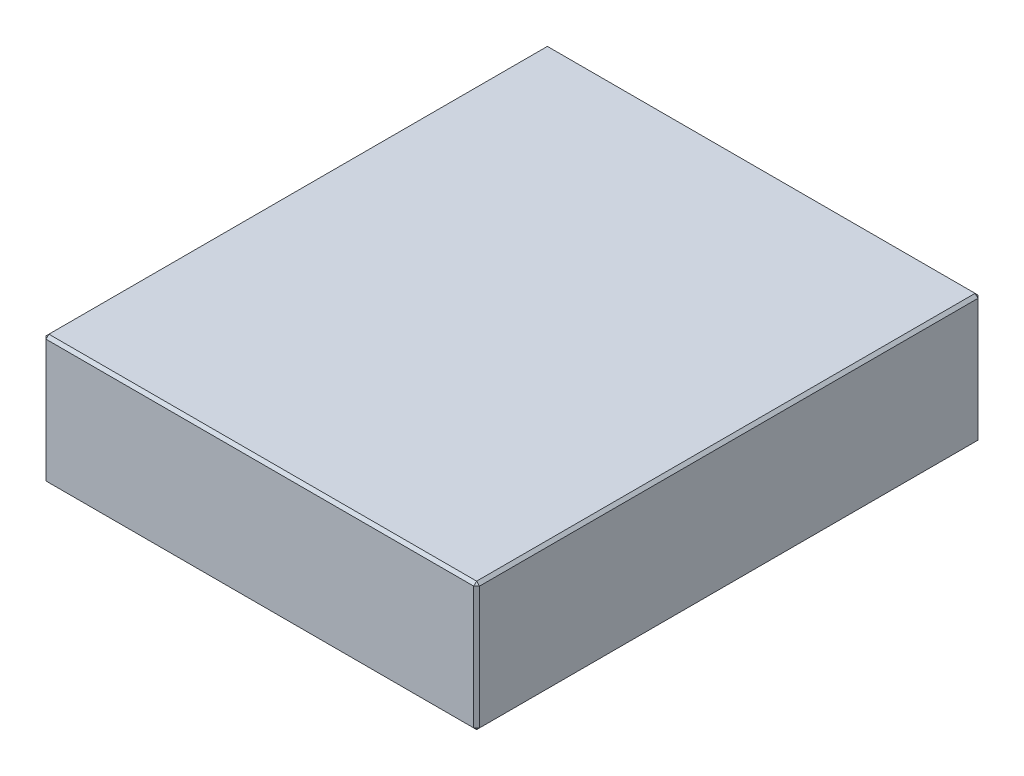
ISO-10303-21;
HEADER;
FILE_DESCRIPTION(('STEP AP214'),'2;1');
FILE_NAME('part.step','',(''),(''),'','','');
FILE_SCHEMA(('AUTOMOTIVE_DESIGN { 1 0 10303 214 1 1 1 1 }'));
ENDSEC;
DATA;
#1=APPLICATION_CONTEXT('core data for automotive mechanical design processes');
#2=APPLICATION_PROTOCOL_DEFINITION('international standard','automotive_design',2000,#1);
#3=PRODUCT_CONTEXT('',#1,'mechanical');
#4=PRODUCT('Part','Part','',(#3));
#5=PRODUCT_RELATED_PRODUCT_CATEGORY('part','',(#4));
#6=PRODUCT_DEFINITION_FORMATION('','',#4);
#7=PRODUCT_DEFINITION_CONTEXT('part definition',#1,'design');
#8=PRODUCT_DEFINITION('design','',#6,#7);
#9=PRODUCT_DEFINITION_SHAPE('','',#8);
#10=(LENGTH_UNIT() NAMED_UNIT(*) SI_UNIT(.MILLI.,.METRE.));
#11=(NAMED_UNIT(*) PLANE_ANGLE_UNIT() SI_UNIT($,.RADIAN.));
#12=(NAMED_UNIT(*) SI_UNIT($,.STERADIAN.) SOLID_ANGLE_UNIT());
#13=UNCERTAINTY_MEASURE_WITH_UNIT(LENGTH_MEASURE(1.E-05),#10,'distance_accuracy_value','');
#14=(GEOMETRIC_REPRESENTATION_CONTEXT(3) GLOBAL_UNCERTAINTY_ASSIGNED_CONTEXT((#13)) GLOBAL_UNIT_ASSIGNED_CONTEXT((#10,
#11,#12)) REPRESENTATION_CONTEXT('',''));
#15=CARTESIAN_POINT('',(0.,0.,0.));
#16=DIRECTION('',(0.,0.,1.));
#17=DIRECTION('',(1.,0.,0.));
#18=AXIS2_PLACEMENT_3D('',#15,#16,#17);
#19=CARTESIAN_POINT('',(15.,-4.45,34.896));
#20=DIRECTION('',(-1.,0.,0.));
#21=DIRECTION('',(0.,0.,1.));
#22=AXIS2_PLACEMENT_3D('',#19,#20,#21);
#23=PLANE('',#22);
#24=DIRECTION('',(0.,1.,0.));
#25=VECTOR('',#24,1.);
#26=CARTESIAN_POINT('',(15.,4.45,0.200000000000006));
#27=LINE('',#26,#25);
#28=CARTESIAN_POINT('',(15.,-4.24999999999999,0.200000000000006));
#29=VERTEX_POINT('',#28);
#30=CARTESIAN_POINT('',(15.,4.24999999999999,0.200000000000006));
#31=VERTEX_POINT('',#30);
#32=EDGE_CURVE('E192',#29,#31,#27,.T.);
#33=ORIENTED_EDGE('',*,*,#32,.T.);
#34=DIRECTION('',(0.,0.,1.));
#35=VECTOR('',#34,1.);
#36=CARTESIAN_POINT('',(15.,4.24999999999999,34.896));
#37=LINE('',#36,#35);
#38=CARTESIAN_POINT('',(15.,4.24999999999999,34.696));
#39=VERTEX_POINT('',#38);
#40=EDGE_CURVE('E194',#31,#39,#37,.T.);
#41=ORIENTED_EDGE('',*,*,#40,.T.);
#42=DIRECTION('',(0.,-1.,0.));
#43=VECTOR('',#42,1.);
#44=CARTESIAN_POINT('',(15.,-4.45,34.696));
#45=LINE('',#44,#43);
#46=CARTESIAN_POINT('',(15.,-4.24999999999999,34.696));
#47=VERTEX_POINT('',#46);
#48=EDGE_CURVE('E189',#39,#47,#45,.T.);
#49=ORIENTED_EDGE('',*,*,#48,.T.);
#50=DIRECTION('',(0.,0.,-1.));
#51=VECTOR('',#50,1.);
#52=CARTESIAN_POINT('',(15.,-4.24999999999999,34.896));
#53=LINE('',#52,#51);
#54=EDGE_CURVE('E146',#47,#29,#53,.T.);
#55=ORIENTED_EDGE('',*,*,#54,.T.);
#56=EDGE_LOOP('',(#33,#41,#49,#55));
#57=FACE_BOUND('',#56,.T.);
#58=ADVANCED_FACE('F39',(#57),#23,.F.);
#59=CARTESIAN_POINT('',(-15.,4.45,34.896));
#60=DIRECTION('',(0.,-1.,0.));
#61=DIRECTION('',(0.,0.,-1.));
#62=AXIS2_PLACEMENT_3D('',#59,#60,#61);
#63=PLANE('',#62);
#64=DIRECTION('',(0.,0.,-1.));
#65=VECTOR('',#64,1.);
#66=CARTESIAN_POINT('',(14.8,4.45,34.896));
#67=LINE('',#66,#65);
#68=CARTESIAN_POINT('',(14.8,4.45,34.696));
#69=VERTEX_POINT('',#68);
#70=CARTESIAN_POINT('',(14.8,4.45,0.200000000000006));
#71=VERTEX_POINT('',#70);
#72=EDGE_CURVE('E182',#69,#71,#67,.T.);
#73=ORIENTED_EDGE('',*,*,#72,.T.);
#74=DIRECTION('',(-1.,0.,0.));
#75=VECTOR('',#74,1.);
#76=CARTESIAN_POINT('',(-15.,4.45,0.200000000000006));
#77=LINE('',#76,#75);
#78=CARTESIAN_POINT('',(-14.8,4.45,0.200000000000006));
#79=VERTEX_POINT('',#78);
#80=EDGE_CURVE('E187',#71,#79,#77,.T.);
#81=ORIENTED_EDGE('',*,*,#80,.T.);
#82=DIRECTION('',(0.,0.,1.));
#83=VECTOR('',#82,1.);
#84=CARTESIAN_POINT('',(-14.8,4.45,34.896));
#85=LINE('',#84,#83);
#86=CARTESIAN_POINT('',(-14.8,4.45,34.696));
#87=VERTEX_POINT('',#86);
#88=EDGE_CURVE('E184',#79,#87,#85,.T.);
#89=ORIENTED_EDGE('',*,*,#88,.T.);
#90=DIRECTION('',(1.,0.,0.));
#91=VECTOR('',#90,1.);
#92=CARTESIAN_POINT('',(-15.,4.45,34.696));
#93=LINE('',#92,#91);
#94=EDGE_CURVE('E180',#87,#69,#93,.T.);
#95=ORIENTED_EDGE('',*,*,#94,.T.);
#96=EDGE_LOOP('',(#73,#81,#89,#95));
#97=FACE_BOUND('',#96,.T.);
#98=ADVANCED_FACE('F282',(#97),#63,.F.);
#99=CARTESIAN_POINT('',(-15.,-4.45,34.896));
#100=DIRECTION('',(1.,0.,0.));
#101=DIRECTION('',(0.,0.,-1.));
#102=AXIS2_PLACEMENT_3D('',#99,#100,#101);
#103=PLANE('',#102);
#104=DIRECTION('',(0.,0.,-1.));
#105=VECTOR('',#104,1.);
#106=CARTESIAN_POINT('',(-15.,4.24999999999999,34.896));
#107=LINE('',#106,#105);
#108=CARTESIAN_POINT('',(-15.,4.24999999999999,34.696));
#109=VERTEX_POINT('',#108);
#110=CARTESIAN_POINT('',(-15.,4.24999999999999,0.200000000000006));
#111=VERTEX_POINT('',#110);
#112=EDGE_CURVE('E173',#109,#111,#107,.T.);
#113=ORIENTED_EDGE('',*,*,#112,.T.);
#114=DIRECTION('',(0.,-1.,0.));
#115=VECTOR('',#114,1.);
#116=CARTESIAN_POINT('',(-15.,-4.45,0.200000000000006));
#117=LINE('',#116,#115);
#118=CARTESIAN_POINT('',(-15.,-4.24999999999999,0.200000000000006));
#119=VERTEX_POINT('',#118);
#120=EDGE_CURVE('E178',#111,#119,#117,.T.);
#121=ORIENTED_EDGE('',*,*,#120,.T.);
#122=DIRECTION('',(0.,0.,1.));
#123=VECTOR('',#122,1.);
#124=CARTESIAN_POINT('',(-15.,-4.24999999999999,34.896));
#125=LINE('',#124,#123);
#126=CARTESIAN_POINT('',(-15.,-4.24999999999999,34.696));
#127=VERTEX_POINT('',#126);
#128=EDGE_CURVE('E175',#119,#127,#125,.T.);
#129=ORIENTED_EDGE('',*,*,#128,.T.);
#130=DIRECTION('',(0.,1.,0.));
#131=VECTOR('',#130,1.);
#132=CARTESIAN_POINT('',(-15.,-4.45,34.696));
#133=LINE('',#132,#131);
#134=EDGE_CURVE('E171',#127,#109,#133,.T.);
#135=ORIENTED_EDGE('',*,*,#134,.T.);
#136=EDGE_LOOP('',(#113,#121,#129,#135));
#137=FACE_BOUND('',#136,.T.);
#138=ADVANCED_FACE('F307',(#137),#103,.F.);
#139=CARTESIAN_POINT('',(-15.,-4.45,34.896));
#140=DIRECTION('',(0.,1.,0.));
#141=DIRECTION('',(0.,0.,1.));
#142=AXIS2_PLACEMENT_3D('',#139,#140,#141);
#143=PLANE('',#142);
#144=DIRECTION('',(-1.,0.,0.));
#145=VECTOR('',#144,1.);
#146=CARTESIAN_POINT('',(-15.,-4.45,34.696));
#147=LINE('',#146,#145);
#148=CARTESIAN_POINT('',(14.8,-4.45,34.696));
#149=VERTEX_POINT('',#148);
#150=CARTESIAN_POINT('',(-14.8,-4.45,34.696));
#151=VERTEX_POINT('',#150);
#152=EDGE_CURVE('E133',#149,#151,#147,.T.);
#153=ORIENTED_EDGE('',*,*,#152,.T.);
#154=DIRECTION('',(0.,0.,-1.));
#155=VECTOR('',#154,1.);
#156=CARTESIAN_POINT('',(-14.8,-4.45,34.896));
#157=LINE('',#156,#155);
#158=CARTESIAN_POINT('',(-14.8,-4.45,0.200000000000006));
#159=VERTEX_POINT('',#158);
#160=EDGE_CURVE('E169',#151,#159,#157,.T.);
#161=ORIENTED_EDGE('',*,*,#160,.T.);
#162=DIRECTION('',(1.,0.,0.));
#163=VECTOR('',#162,1.);
#164=CARTESIAN_POINT('',(15.,-4.45,0.200000000000006));
#165=LINE('',#164,#163);
#166=CARTESIAN_POINT('',(14.8,-4.45,0.200000000000006));
#167=VERTEX_POINT('',#166);
#168=EDGE_CURVE('E136',#159,#167,#165,.T.);
#169=ORIENTED_EDGE('',*,*,#168,.T.);
#170=DIRECTION('',(0.,0.,1.));
#171=VECTOR('',#170,1.);
#172=CARTESIAN_POINT('',(14.8,-4.45,34.896));
#173=LINE('',#172,#171);
#174=EDGE_CURVE('E128',#167,#149,#173,.T.);
#175=ORIENTED_EDGE('',*,*,#174,.T.);
#176=EDGE_LOOP('',(#153,#161,#169,#175));
#177=FACE_BOUND('',#176,.T.);
#178=ADVANCED_FACE('F130',(#177),#143,.F.);
#179=CARTESIAN_POINT('',(0.,0.,34.896));
#180=DIRECTION('',(0.,0.,-1.));
#181=DIRECTION('',(-1.,0.,0.));
#182=AXIS2_PLACEMENT_3D('',#179,#180,#181);
#183=PLANE('',#182);
#184=DIRECTION('',(-1.,0.,0.));
#185=VECTOR('',#184,1.);
#186=CARTESIAN_POINT('',(0.,4.24999999999999,34.896));
#187=LINE('',#186,#185);
#188=CARTESIAN_POINT('',(14.8,4.24999999999999,34.896));
#189=VERTEX_POINT('',#188);
#190=CARTESIAN_POINT('',(-14.8,4.24999999999999,34.896));
#191=VERTEX_POINT('',#190);
#192=EDGE_CURVE('E49',#189,#191,#187,.T.);
#193=ORIENTED_EDGE('',*,*,#192,.T.);
#194=DIRECTION('',(0.,-1.,0.));
#195=VECTOR('',#194,1.);
#196=CARTESIAN_POINT('',(-14.8,0.,34.896));
#197=LINE('',#196,#195);
#198=CARTESIAN_POINT('',(-14.8,-4.24999999999999,34.896));
#199=VERTEX_POINT('',#198);
#200=EDGE_CURVE('E11',#191,#199,#197,.T.);
#201=ORIENTED_EDGE('',*,*,#200,.T.);
#202=DIRECTION('',(1.,0.,0.));
#203=VECTOR('',#202,1.);
#204=CARTESIAN_POINT('',(0.,-4.24999999999999,34.896));
#205=LINE('',#204,#203);
#206=CARTESIAN_POINT('',(14.8,-4.24999999999999,34.896));
#207=VERTEX_POINT('',#206);
#208=EDGE_CURVE('E206',#199,#207,#205,.T.);
#209=ORIENTED_EDGE('',*,*,#208,.T.);
#210=DIRECTION('',(0.,1.,0.));
#211=VECTOR('',#210,1.);
#212=CARTESIAN_POINT('',(14.8,0.,34.896));
#213=LINE('',#212,#211);
#214=EDGE_CURVE('E60',#207,#189,#213,.T.);
#215=ORIENTED_EDGE('',*,*,#214,.T.);
#216=EDGE_LOOP('',(#193,#201,#209,#215));
#217=FACE_BOUND('',#216,.T.);
#218=ADVANCED_FACE('F427',(#217),#183,.F.);
#219=CARTESIAN_POINT('',(0.,0.,0.));
#220=DIRECTION('',(0.,0.,-1.));
#221=DIRECTION('',(-1.,0.,0.));
#222=AXIS2_PLACEMENT_3D('',#219,#220,#221);
#223=PLANE('',#222);
#224=DIRECTION('',(-1.,0.,0.));
#225=VECTOR('',#224,1.);
#226=CARTESIAN_POINT('',(-15.,-4.24999999999999,0.));
#227=LINE('',#226,#225);
#228=CARTESIAN_POINT('',(14.8,-4.24999999999999,0.));
#229=VERTEX_POINT('',#228);
#230=CARTESIAN_POINT('',(-14.8,-4.24999999999999,0.));
#231=VERTEX_POINT('',#230);
#232=EDGE_CURVE('E197',#229,#231,#227,.T.);
#233=ORIENTED_EDGE('',*,*,#232,.T.);
#234=DIRECTION('',(0.,1.,0.));
#235=VECTOR('',#234,1.);
#236=CARTESIAN_POINT('',(-14.8,4.45,0.));
#237=LINE('',#236,#235);
#238=CARTESIAN_POINT('',(-14.8,4.24999999999999,0.));
#239=VERTEX_POINT('',#238);
#240=EDGE_CURVE('E203',#231,#239,#237,.T.);
#241=ORIENTED_EDGE('',*,*,#240,.T.);
#242=DIRECTION('',(1.,0.,0.));
#243=VECTOR('',#242,1.);
#244=CARTESIAN_POINT('',(15.,4.24999999999999,0.));
#245=LINE('',#244,#243);
#246=CARTESIAN_POINT('',(14.8,4.24999999999999,0.));
#247=VERTEX_POINT('',#246);
#248=EDGE_CURVE('E201',#239,#247,#245,.T.);
#249=ORIENTED_EDGE('',*,*,#248,.T.);
#250=DIRECTION('',(0.,-1.,0.));
#251=VECTOR('',#250,1.);
#252=CARTESIAN_POINT('',(14.8,-4.45,0.));
#253=LINE('',#252,#251);
#254=EDGE_CURVE('E199',#247,#229,#253,.T.);
#255=ORIENTED_EDGE('',*,*,#254,.T.);
#256=EDGE_LOOP('',(#233,#241,#249,#255));
#257=FACE_BOUND('',#256,.T.);
#258=ADVANCED_FACE('F273',(#257),#223,.T.);
#259=CARTESIAN_POINT('',(14.8,4.45,34.896));
#260=DIRECTION('',(-0.707106781186548,-0.707106781186548,0.));
#261=DIRECTION('',(0.,0.,-1.));
#262=AXIS2_PLACEMENT_3D('',#259,#260,#261);
#263=PLANE('',#262);
#264=DIRECTION('',(0.707106781186548,-0.707106781186548,0.));
#265=VECTOR('',#264,1.);
#266=CARTESIAN_POINT('',(15.,4.24999999999999,34.696));
#267=LINE('',#266,#265);
#268=EDGE_CURVE('E44',#39,#69,#267,.F.);
#269=ORIENTED_EDGE('',*,*,#268,.F.);
#270=ORIENTED_EDGE('',*,*,#40,.F.);
#271=DIRECTION('',(-0.707106781186548,0.707106781186548,0.));
#272=VECTOR('',#271,1.);
#273=CARTESIAN_POINT('',(14.8,4.45,0.200000000000006));
#274=LINE('',#273,#272);
#275=EDGE_CURVE('E166',#71,#31,#274,.F.);
#276=ORIENTED_EDGE('',*,*,#275,.F.);
#277=ORIENTED_EDGE('',*,*,#72,.F.);
#278=EDGE_LOOP('',(#269,#270,#276,#277));
#279=FACE_BOUND('',#278,.T.);
#280=ADVANCED_FACE('F42',(#279),#263,.F.);
#281=CARTESIAN_POINT('',(15.,4.24999999999999,34.696));
#282=DIRECTION('',(0.577350269189626,0.577350269189626,0.577350269189626));
#283=DIRECTION('',(0.707106781186547,0.,-0.707106781186547));
#284=AXIS2_PLACEMENT_3D('',#281,#282,#283);
#285=PLANE('',#284);
#286=DIRECTION('',(-0.707106781186548,0.,0.707106781186548));
#287=VECTOR('',#286,1.);
#288=CARTESIAN_POINT('',(15.,4.24999999999999,34.696));
#289=LINE('',#288,#287);
#290=EDGE_CURVE('E252',#39,#189,#289,.T.);
#291=ORIENTED_EDGE('',*,*,#290,.F.);
#292=ORIENTED_EDGE('',*,*,#268,.T.);
#293=DIRECTION('',(0.,0.707106781186548,-0.707106781186548));
#294=VECTOR('',#293,1.);
#295=CARTESIAN_POINT('',(14.8,4.35,34.796));
#296=LINE('',#295,#294);
#297=EDGE_CURVE('E254',#189,#69,#296,.T.);
#298=ORIENTED_EDGE('',*,*,#297,.F.);
#299=EDGE_LOOP('',(#291,#292,#298));
#300=FACE_BOUND('',#299,.T.);
#301=ADVANCED_FACE('F298',(#300),#285,.T.);
#302=CARTESIAN_POINT('',(14.8,4.45,0.200000000000006));
#303=DIRECTION('',(0.577350269189626,0.577350269189626,-0.577350269189626));
#304=DIRECTION('',(-0.707106781186547,0.,-0.707106781186547));
#305=AXIS2_PLACEMENT_3D('',#302,#303,#304);
#306=PLANE('',#305);
#307=DIRECTION('',(0.,0.707106781186548,0.707106781186548));
#308=VECTOR('',#307,1.);
#309=CARTESIAN_POINT('',(14.8,4.45,0.200000000000006));
#310=LINE('',#309,#308);
#311=EDGE_CURVE('E246',#71,#247,#310,.F.);
#312=ORIENTED_EDGE('',*,*,#311,.F.);
#313=ORIENTED_EDGE('',*,*,#275,.T.);
#314=DIRECTION('',(-0.707106781186548,0.,-0.707106781186548));
#315=VECTOR('',#314,1.);
#316=CARTESIAN_POINT('',(14.9,4.24999999999999,0.100000000000003));
#317=LINE('',#316,#315);
#318=EDGE_CURVE('E249',#247,#31,#317,.F.);
#319=ORIENTED_EDGE('',*,*,#318,.F.);
#320=EDGE_LOOP('',(#312,#313,#319));
#321=FACE_BOUND('',#320,.T.);
#322=ADVANCED_FACE('F261',(#321),#306,.T.);
#323=CARTESIAN_POINT('',(0.,4.24999999999999,34.896));
#324=DIRECTION('',(0.,-0.707106781186548,-0.707106781186548));
#325=DIRECTION('',(-1.,0.,0.));
#326=AXIS2_PLACEMENT_3D('',#323,#324,#325);
#327=PLANE('',#326);
#328=ORIENTED_EDGE('',*,*,#297,.T.);
#329=ORIENTED_EDGE('',*,*,#94,.F.);
#330=DIRECTION('',(0.,-0.707106781186548,0.707106781186548));
#331=VECTOR('',#330,1.);
#332=CARTESIAN_POINT('',(-14.8,4.45,34.696));
#333=LINE('',#332,#331);
#334=EDGE_CURVE('E241',#191,#87,#333,.F.);
#335=ORIENTED_EDGE('',*,*,#334,.F.);
#336=ORIENTED_EDGE('',*,*,#192,.F.);
#337=EDGE_LOOP('',(#328,#329,#335,#336));
#338=FACE_BOUND('',#337,.T.);
#339=ADVANCED_FACE('F293',(#338),#327,.F.);
#340=CARTESIAN_POINT('',(14.8,0.,34.896));
#341=DIRECTION('',(-0.707106781186548,0.,-0.707106781186548));
#342=DIRECTION('',(0.,1.,0.));
#343=AXIS2_PLACEMENT_3D('',#340,#341,#342);
#344=PLANE('',#343);
#345=ORIENTED_EDGE('',*,*,#290,.T.);
#346=ORIENTED_EDGE('',*,*,#214,.F.);
#347=DIRECTION('',(0.707106781186548,0.,-0.707106781186548));
#348=VECTOR('',#347,1.);
#349=CARTESIAN_POINT('',(14.9,-4.24999999999999,34.796));
#350=LINE('',#349,#348);
#351=EDGE_CURVE('E150',#47,#207,#350,.F.);
#352=ORIENTED_EDGE('',*,*,#351,.F.);
#353=ORIENTED_EDGE('',*,*,#48,.F.);
#354=EDGE_LOOP('',(#345,#346,#352,#353));
#355=FACE_BOUND('',#354,.T.);
#356=ADVANCED_FACE('F300',(#355),#344,.F.);
#357=CARTESIAN_POINT('',(15.,-4.24999999999999,34.896));
#358=DIRECTION('',(-0.707106781186548,0.707106781186548,0.));
#359=DIRECTION('',(0.,0.,-1.));
#360=AXIS2_PLACEMENT_3D('',#357,#358,#359);
#361=PLANE('',#360);
#362=DIRECTION('',(0.707106781186548,0.707106781186548,0.));
#363=VECTOR('',#362,1.);
#364=CARTESIAN_POINT('',(14.9,-4.35,0.200000000000006));
#365=LINE('',#364,#363);
#366=EDGE_CURVE('E151',#29,#167,#365,.F.);
#367=ORIENTED_EDGE('',*,*,#366,.F.);
#368=ORIENTED_EDGE('',*,*,#54,.F.);
#369=DIRECTION('',(-0.707106781186548,-0.707106781186548,0.));
#370=VECTOR('',#369,1.);
#371=CARTESIAN_POINT('',(14.8,-4.45,34.696));
#372=LINE('',#371,#370);
#373=EDGE_CURVE('E143',#149,#47,#372,.F.);
#374=ORIENTED_EDGE('',*,*,#373,.F.);
#375=ORIENTED_EDGE('',*,*,#174,.F.);
#376=EDGE_LOOP('',(#367,#368,#374,#375));
#377=FACE_BOUND('',#376,.T.);
#378=ADVANCED_FACE('F145',(#377),#361,.F.);
#379=CARTESIAN_POINT('',(15.,-4.45,0.200000000000006));
#380=DIRECTION('',(0.707106781186548,0.,-0.707106781186548));
#381=DIRECTION('',(0.,-1.,0.));
#382=AXIS2_PLACEMENT_3D('',#379,#380,#381);
#383=PLANE('',#382);
#384=ORIENTED_EDGE('',*,*,#318,.T.);
#385=ORIENTED_EDGE('',*,*,#32,.F.);
#386=DIRECTION('',(0.707106781186548,0.,0.707106781186548));
#387=VECTOR('',#386,1.);
#388=CARTESIAN_POINT('',(14.8,-4.24999999999999,0.));
#389=LINE('',#388,#387);
#390=EDGE_CURVE('E236',#229,#29,#389,.T.);
#391=ORIENTED_EDGE('',*,*,#390,.F.);
#392=ORIENTED_EDGE('',*,*,#254,.F.);
#393=EDGE_LOOP('',(#384,#385,#391,#392));
#394=FACE_BOUND('',#393,.T.);
#395=ADVANCED_FACE('F269',(#394),#383,.T.);
#396=CARTESIAN_POINT('',(-15.,4.45,0.200000000000006));
#397=DIRECTION('',(0.,0.707106781186548,-0.707106781186548));
#398=DIRECTION('',(1.,0.,0.));
#399=AXIS2_PLACEMENT_3D('',#396,#397,#398);
#400=PLANE('',#399);
#401=ORIENTED_EDGE('',*,*,#311,.T.);
#402=ORIENTED_EDGE('',*,*,#248,.F.);
#403=DIRECTION('',(0.,-0.707106781186548,-0.707106781186548));
#404=VECTOR('',#403,1.);
#405=CARTESIAN_POINT('',(-14.8,4.35,0.100000000000003));
#406=LINE('',#405,#404);
#407=EDGE_CURVE('E233',#79,#239,#406,.T.);
#408=ORIENTED_EDGE('',*,*,#407,.F.);
#409=ORIENTED_EDGE('',*,*,#80,.F.);
#410=EDGE_LOOP('',(#401,#402,#408,#409));
#411=FACE_BOUND('',#410,.T.);
#412=ADVANCED_FACE('F279',(#411),#400,.T.);
#413=CARTESIAN_POINT('',(-15.,4.24999999999999,34.896));
#414=DIRECTION('',(0.707106781186548,-0.707106781186548,0.));
#415=DIRECTION('',(0.,0.,-1.));
#416=AXIS2_PLACEMENT_3D('',#413,#414,#415);
#417=PLANE('',#416);
#418=DIRECTION('',(0.707106781186548,0.707106781186548,0.));
#419=VECTOR('',#418,1.);
#420=CARTESIAN_POINT('',(-14.8,4.45,34.696));
#421=LINE('',#420,#419);
#422=EDGE_CURVE('E243',#87,#109,#421,.F.);
#423=ORIENTED_EDGE('',*,*,#422,.F.);
#424=ORIENTED_EDGE('',*,*,#88,.F.);
#425=DIRECTION('',(-0.707106781186548,-0.707106781186548,0.));
#426=VECTOR('',#425,1.);
#427=CARTESIAN_POINT('',(-15.,4.24999999999999,0.200000000000006));
#428=LINE('',#427,#426);
#429=EDGE_CURVE('E230',#111,#79,#428,.F.);
#430=ORIENTED_EDGE('',*,*,#429,.F.);
#431=ORIENTED_EDGE('',*,*,#112,.F.);
#432=EDGE_LOOP('',(#423,#424,#430,#431));
#433=FACE_BOUND('',#432,.T.);
#434=ADVANCED_FACE('F286',(#433),#417,.F.);
#435=CARTESIAN_POINT('',(-14.8,4.45,34.696));
#436=DIRECTION('',(-0.577350269189626,0.577350269189626,0.577350269189626));
#437=DIRECTION('',(0.707106781186547,0.,0.707106781186547));
#438=AXIS2_PLACEMENT_3D('',#435,#436,#437);
#439=PLANE('',#438);
#440=ORIENTED_EDGE('',*,*,#334,.T.);
#441=ORIENTED_EDGE('',*,*,#422,.T.);
#442=DIRECTION('',(-0.707106781186548,0.,-0.707106781186548));
#443=VECTOR('',#442,1.);
#444=CARTESIAN_POINT('',(-14.9,4.24999999999999,34.796));
#445=LINE('',#444,#443);
#446=EDGE_CURVE('E158',#191,#109,#445,.T.);
#447=ORIENTED_EDGE('',*,*,#446,.F.);
#448=EDGE_LOOP('',(#440,#441,#447));
#449=FACE_BOUND('',#448,.T.);
#450=ADVANCED_FACE('F378',(#449),#439,.T.);
#451=CARTESIAN_POINT('',(14.8,-4.45,34.696));
#452=DIRECTION('',(0.577350269189626,-0.577350269189626,0.577350269189626));
#453=DIRECTION('',(0.707106781186547,0.,-0.707106781186547));
#454=AXIS2_PLACEMENT_3D('',#451,#452,#453);
#455=PLANE('',#454);
#456=ORIENTED_EDGE('',*,*,#373,.T.);
#457=ORIENTED_EDGE('',*,*,#351,.T.);
#458=DIRECTION('',(0.,0.707106781186548,0.707106781186548));
#459=VECTOR('',#458,1.);
#460=CARTESIAN_POINT('',(14.8,-4.45,34.696));
#461=LINE('',#460,#459);
#462=EDGE_CURVE('E154',#149,#207,#461,.T.);
#463=ORIENTED_EDGE('',*,*,#462,.F.);
#464=EDGE_LOOP('',(#456,#457,#463));
#465=FACE_BOUND('',#464,.T.);
#466=ADVANCED_FACE('F155',(#465),#455,.T.);
#467=CARTESIAN_POINT('',(14.8,-4.24999999999999,0.));
#468=DIRECTION('',(0.577350269189626,-0.577350269189626,-0.577350269189626));
#469=DIRECTION('',(-0.707106781186547,0.,-0.707106781186547));
#470=AXIS2_PLACEMENT_3D('',#467,#468,#469);
#471=PLANE('',#470);
#472=ORIENTED_EDGE('',*,*,#390,.T.);
#473=ORIENTED_EDGE('',*,*,#366,.T.);
#474=DIRECTION('',(0.,0.707106781186548,-0.707106781186548));
#475=VECTOR('',#474,1.);
#476=CARTESIAN_POINT('',(14.8,-4.24999999999999,0.));
#477=LINE('',#476,#475);
#478=EDGE_CURVE('E159',#229,#167,#477,.F.);
#479=ORIENTED_EDGE('',*,*,#478,.F.);
#480=EDGE_LOOP('',(#472,#473,#479));
#481=FACE_BOUND('',#480,.T.);
#482=ADVANCED_FACE('F365',(#481),#471,.T.);
#483=CARTESIAN_POINT('',(-15.,4.24999999999999,0.200000000000006));
#484=DIRECTION('',(-0.577350269189626,0.577350269189626,-0.577350269189626));
#485=DIRECTION('',(-0.707106781186547,0.,0.707106781186547));
#486=AXIS2_PLACEMENT_3D('',#483,#484,#485);
#487=PLANE('',#486);
#488=ORIENTED_EDGE('',*,*,#429,.T.);
#489=ORIENTED_EDGE('',*,*,#407,.T.);
#490=DIRECTION('',(-0.707106781186548,0.,0.707106781186548));
#491=VECTOR('',#490,1.);
#492=CARTESIAN_POINT('',(-15.,4.24999999999999,0.200000000000006));
#493=LINE('',#492,#491);
#494=EDGE_CURVE('E224',#111,#239,#493,.F.);
#495=ORIENTED_EDGE('',*,*,#494,.F.);
#496=EDGE_LOOP('',(#488,#489,#495));
#497=FACE_BOUND('',#496,.T.);
#498=ADVANCED_FACE('F358',(#497),#487,.T.);
#499=CARTESIAN_POINT('',(-14.8,0.,34.896));
#500=DIRECTION('',(0.707106781186548,0.,-0.707106781186548));
#501=DIRECTION('',(0.,-1.,0.));
#502=AXIS2_PLACEMENT_3D('',#499,#500,#501);
#503=PLANE('',#502);
#504=ORIENTED_EDGE('',*,*,#446,.T.);
#505=ORIENTED_EDGE('',*,*,#134,.F.);
#506=DIRECTION('',(0.707106781186548,0.,0.707106781186548));
#507=VECTOR('',#506,1.);
#508=CARTESIAN_POINT('',(-15.,-4.24999999999999,34.696));
#509=LINE('',#508,#507);
#510=EDGE_CURVE('E221',#199,#127,#509,.F.);
#511=ORIENTED_EDGE('',*,*,#510,.F.);
#512=ORIENTED_EDGE('',*,*,#200,.F.);
#513=EDGE_LOOP('',(#504,#505,#511,#512));
#514=FACE_BOUND('',#513,.T.);
#515=ADVANCED_FACE('F352',(#514),#503,.F.);
#516=CARTESIAN_POINT('',(0.,-4.24999999999999,34.896));
#517=DIRECTION('',(0.,0.707106781186548,-0.707106781186548));
#518=DIRECTION('',(1.,0.,0.));
#519=AXIS2_PLACEMENT_3D('',#516,#517,#518);
#520=PLANE('',#519);
#521=ORIENTED_EDGE('',*,*,#462,.T.);
#522=ORIENTED_EDGE('',*,*,#208,.F.);
#523=DIRECTION('',(0.,-0.707106781186548,-0.707106781186548));
#524=VECTOR('',#523,1.);
#525=CARTESIAN_POINT('',(-14.8,-4.35,34.796));
#526=LINE('',#525,#524);
#527=EDGE_CURVE('E162',#151,#199,#526,.F.);
#528=ORIENTED_EDGE('',*,*,#527,.F.);
#529=ORIENTED_EDGE('',*,*,#152,.F.);
#530=EDGE_LOOP('',(#521,#522,#528,#529));
#531=FACE_BOUND('',#530,.T.);
#532=ADVANCED_FACE('F161',(#531),#520,.F.);
#533=CARTESIAN_POINT('',(-15.,-4.45,0.200000000000006));
#534=DIRECTION('',(0.,-0.707106781186548,-0.707106781186548));
#535=DIRECTION('',(-1.,0.,0.));
#536=AXIS2_PLACEMENT_3D('',#533,#534,#535);
#537=PLANE('',#536);
#538=ORIENTED_EDGE('',*,*,#478,.T.);
#539=ORIENTED_EDGE('',*,*,#168,.F.);
#540=DIRECTION('',(0.,-0.707106781186548,0.707106781186548));
#541=VECTOR('',#540,1.);
#542=CARTESIAN_POINT('',(-14.8,-4.45,0.200000000000006));
#543=LINE('',#542,#541);
#544=EDGE_CURVE('E217',#231,#159,#543,.T.);
#545=ORIENTED_EDGE('',*,*,#544,.F.);
#546=ORIENTED_EDGE('',*,*,#232,.F.);
#547=EDGE_LOOP('',(#538,#539,#545,#546));
#548=FACE_BOUND('',#547,.T.);
#549=ADVANCED_FACE('F339',(#548),#537,.T.);
#550=CARTESIAN_POINT('',(-15.,-4.45,0.200000000000006));
#551=DIRECTION('',(-0.707106781186548,0.,-0.707106781186548));
#552=DIRECTION('',(0.,1.,0.));
#553=AXIS2_PLACEMENT_3D('',#550,#551,#552);
#554=PLANE('',#553);
#555=ORIENTED_EDGE('',*,*,#494,.T.);
#556=ORIENTED_EDGE('',*,*,#240,.F.);
#557=DIRECTION('',(0.707106781186548,0.,-0.707106781186548));
#558=VECTOR('',#557,1.);
#559=CARTESIAN_POINT('',(-14.9,-4.24999999999999,0.100000000000003));
#560=LINE('',#559,#558);
#561=EDGE_CURVE('E214',#119,#231,#560,.T.);
#562=ORIENTED_EDGE('',*,*,#561,.F.);
#563=ORIENTED_EDGE('',*,*,#120,.F.);
#564=EDGE_LOOP('',(#555,#556,#562,#563));
#565=FACE_BOUND('',#564,.T.);
#566=ADVANCED_FACE('F332',(#565),#554,.T.);
#567=CARTESIAN_POINT('',(-15.,-4.24999999999999,34.696));
#568=DIRECTION('',(-0.577350269189626,-0.577350269189626,0.577350269189626));
#569=DIRECTION('',(0.707106781186547,0.,0.707106781186547));
#570=AXIS2_PLACEMENT_3D('',#567,#568,#569);
#571=PLANE('',#570);
#572=ORIENTED_EDGE('',*,*,#527,.T.);
#573=ORIENTED_EDGE('',*,*,#510,.T.);
#574=DIRECTION('',(-0.707106781186548,0.707106781186548,0.));
#575=VECTOR('',#574,1.);
#576=CARTESIAN_POINT('',(-15.,-4.24999999999999,34.696));
#577=LINE('',#576,#575);
#578=EDGE_CURVE('E212',#151,#127,#577,.T.);
#579=ORIENTED_EDGE('',*,*,#578,.F.);
#580=EDGE_LOOP('',(#572,#573,#579));
#581=FACE_BOUND('',#580,.T.);
#582=ADVANCED_FACE('F325',(#581),#571,.T.);
#583=CARTESIAN_POINT('',(-14.8,-4.45,0.200000000000006));
#584=DIRECTION('',(-0.577350269189626,-0.577350269189626,-0.577350269189626));
#585=DIRECTION('',(-0.707106781186547,0.,0.707106781186547));
#586=AXIS2_PLACEMENT_3D('',#583,#584,#585);
#587=PLANE('',#586);
#588=ORIENTED_EDGE('',*,*,#561,.T.);
#589=ORIENTED_EDGE('',*,*,#544,.T.);
#590=DIRECTION('',(0.707106781186548,-0.707106781186548,0.));
#591=VECTOR('',#590,1.);
#592=CARTESIAN_POINT('',(-14.8,-4.45,0.200000000000006));
#593=LINE('',#592,#591);
#594=EDGE_CURVE('E210',#119,#159,#593,.T.);
#595=ORIENTED_EDGE('',*,*,#594,.F.);
#596=EDGE_LOOP('',(#588,#589,#595));
#597=FACE_BOUND('',#596,.T.);
#598=ADVANCED_FACE('F318',(#597),#587,.T.);
#599=CARTESIAN_POINT('',(-14.8,-4.45,34.896));
#600=DIRECTION('',(0.707106781186548,0.707106781186548,0.));
#601=DIRECTION('',(0.,0.,-1.));
#602=AXIS2_PLACEMENT_3D('',#599,#600,#601);
#603=PLANE('',#602);
#604=ORIENTED_EDGE('',*,*,#578,.T.);
#605=ORIENTED_EDGE('',*,*,#128,.F.);
#606=ORIENTED_EDGE('',*,*,#594,.T.);
#607=ORIENTED_EDGE('',*,*,#160,.F.);
#608=EDGE_LOOP('',(#604,#605,#606,#607));
#609=FACE_BOUND('',#608,.T.);
#610=ADVANCED_FACE('F312',(#609),#603,.F.);
#611=CLOSED_SHELL('',(#58,#98,#138,#178,#218,#258,#280,#301,#322,#339,#356,#378,#395,#412,#434,
#450,#466,#482,#498,#515,#532,#549,#566,#582,#598,#610));
#612=MANIFOLD_SOLID_BREP('B2',#611);
#613=ADVANCED_BREP_SHAPE_REPRESENTATION('',(#18,#612),#14);
#614=SHAPE_DEFINITION_REPRESENTATION(#9,#613);
ENDSEC;
END-ISO-10303-21;
